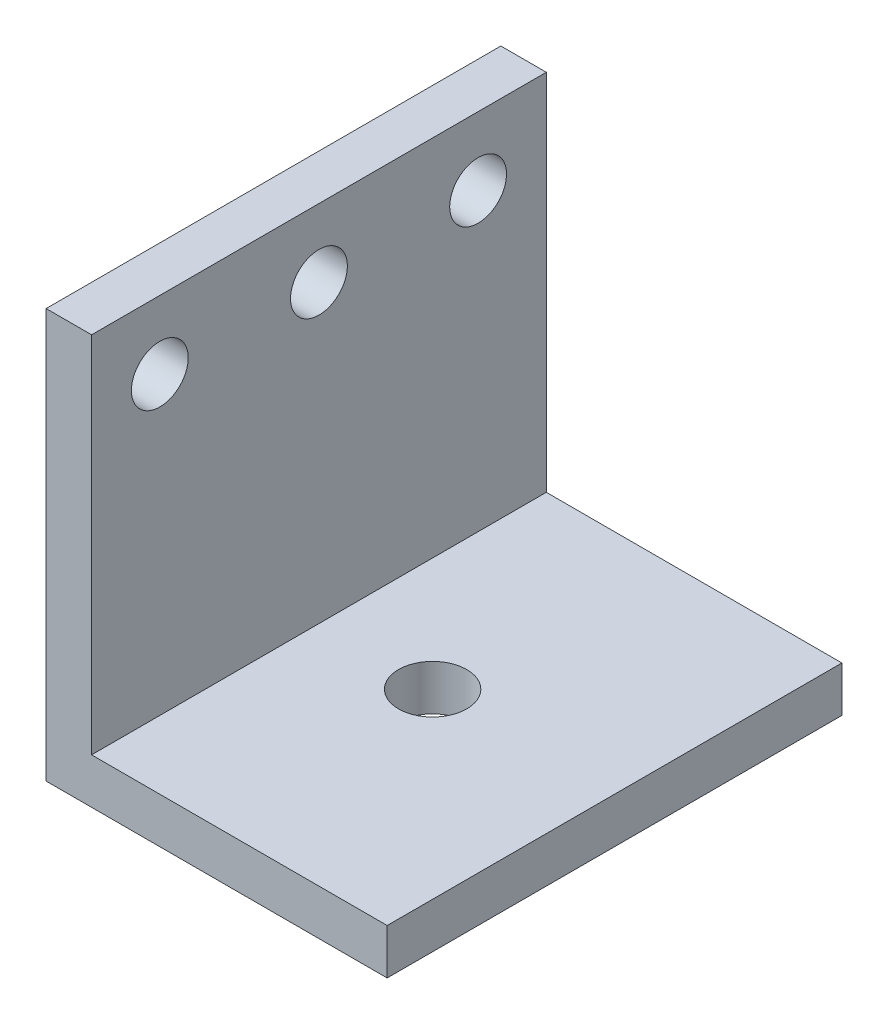
ISO-10303-21;
HEADER;
FILE_DESCRIPTION(('STEP AP214'),'2;1');
FILE_NAME('part.step','',(''),(''),'','','');
FILE_SCHEMA(('AUTOMOTIVE_DESIGN { 1 0 10303 214 1 1 1 1 }'));
ENDSEC;
DATA;
#1=APPLICATION_CONTEXT('core data for automotive mechanical design processes');
#2=APPLICATION_PROTOCOL_DEFINITION('international standard','automotive_design',2000,#1);
#3=PRODUCT_CONTEXT('',#1,'mechanical');
#4=PRODUCT('Part','Part','',(#3));
#5=PRODUCT_RELATED_PRODUCT_CATEGORY('part','',(#4));
#6=PRODUCT_DEFINITION_FORMATION('','',#4);
#7=PRODUCT_DEFINITION_CONTEXT('part definition',#1,'design');
#8=PRODUCT_DEFINITION('design','',#6,#7);
#9=PRODUCT_DEFINITION_SHAPE('','',#8);
#10=(LENGTH_UNIT() NAMED_UNIT(*) SI_UNIT(.MILLI.,.METRE.));
#11=(NAMED_UNIT(*) PLANE_ANGLE_UNIT() SI_UNIT($,.RADIAN.));
#12=(NAMED_UNIT(*) SI_UNIT($,.STERADIAN.) SOLID_ANGLE_UNIT());
#13=UNCERTAINTY_MEASURE_WITH_UNIT(LENGTH_MEASURE(1.E-05),#10,'distance_accuracy_value','');
#14=(GEOMETRIC_REPRESENTATION_CONTEXT(3) GLOBAL_UNCERTAINTY_ASSIGNED_CONTEXT((#13)) GLOBAL_UNIT_ASSIGNED_CONTEXT((#10,
#11,#12)) REPRESENTATION_CONTEXT('',''));
#15=CARTESIAN_POINT('',(0.,0.,0.));
#16=DIRECTION('',(0.,0.,1.));
#17=DIRECTION('',(1.,0.,0.));
#18=AXIS2_PLACEMENT_3D('',#15,#16,#17);
#19=CARTESIAN_POINT('',(0.,0.,100.));
#20=DIRECTION('',(0.,1.,0.));
#21=DIRECTION('',(0.,0.,1.));
#22=AXIS2_PLACEMENT_3D('',#19,#20,#21);
#23=PLANE('',#22);
#24=CARTESIAN_POINT('',(35.,0.,50.));
#25=DIRECTION('',(0.,1.,0.));
#26=DIRECTION('',(0.,0.,1.));
#27=AXIS2_PLACEMENT_3D('',#24,#25,#26);
#28=CIRCLE('',#27,7.5);
#29=CARTESIAN_POINT('',(35.,0.,57.5));
#30=VERTEX_POINT('',#29);
#31=EDGE_CURVE('E161',#30,#30,#28,.T.);
#32=ORIENTED_EDGE('',*,*,#31,.T.);
#33=EDGE_LOOP('',(#32));
#34=FACE_BOUND('',#33,.T.);
#35=DIRECTION('',(1.,0.,0.));
#36=VECTOR('',#35,1.);
#37=CARTESIAN_POINT('',(0.,0.,0.));
#38=LINE('',#37,#36);
#39=CARTESIAN_POINT('',(0.,0.,0.));
#40=VERTEX_POINT('',#39);
#41=CARTESIAN_POINT('',(75.,0.,0.));
#42=VERTEX_POINT('',#41);
#43=EDGE_CURVE('E114',#40,#42,#38,.T.);
#44=ORIENTED_EDGE('',*,*,#43,.T.);
#45=DIRECTION('',(0.,0.,-1.));
#46=VECTOR('',#45,1.);
#47=CARTESIAN_POINT('',(75.,0.,100.));
#48=LINE('',#47,#46);
#49=CARTESIAN_POINT('',(75.,0.,100.));
#50=VERTEX_POINT('',#49);
#51=EDGE_CURVE('E11',#50,#42,#48,.T.);
#52=ORIENTED_EDGE('',*,*,#51,.F.);
#53=DIRECTION('',(1.,0.,0.));
#54=VECTOR('',#53,1.);
#55=CARTESIAN_POINT('',(0.,0.,100.));
#56=LINE('',#55,#54);
#57=CARTESIAN_POINT('',(0.,0.,100.));
#58=VERTEX_POINT('',#57);
#59=EDGE_CURVE('E79',#58,#50,#56,.T.);
#60=ORIENTED_EDGE('',*,*,#59,.F.);
#61=DIRECTION('',(0.,0.,-1.));
#62=VECTOR('',#61,1.);
#63=CARTESIAN_POINT('',(0.,0.,100.));
#64=LINE('',#63,#62);
#65=EDGE_CURVE('E110',#58,#40,#64,.T.);
#66=ORIENTED_EDGE('',*,*,#65,.T.);
#67=EDGE_LOOP('',(#44,#52,#60,#66));
#68=FACE_BOUND('',#67,.T.);
#69=ADVANCED_FACE('F33',(#34,#68),#23,.F.);
#70=CARTESIAN_POINT('',(75.,10.,100.));
#71=DIRECTION('',(1.,0.,0.));
#72=DIRECTION('',(0.,0.,-1.));
#73=AXIS2_PLACEMENT_3D('',#70,#71,#72);
#74=PLANE('',#73);
#75=DIRECTION('',(0.,-1.,0.));
#76=VECTOR('',#75,1.);
#77=CARTESIAN_POINT('',(75.,10.,0.));
#78=LINE('',#77,#76);
#79=CARTESIAN_POINT('',(75.,10.,0.));
#80=VERTEX_POINT('',#79);
#81=EDGE_CURVE('E117',#80,#42,#78,.T.);
#82=ORIENTED_EDGE('',*,*,#81,.F.);
#83=DIRECTION('',(0.,0.,-1.));
#84=VECTOR('',#83,1.);
#85=CARTESIAN_POINT('',(75.,10.,100.));
#86=LINE('',#85,#84);
#87=CARTESIAN_POINT('',(75.,10.,100.));
#88=VERTEX_POINT('',#87);
#89=EDGE_CURVE('E41',#88,#80,#86,.T.);
#90=ORIENTED_EDGE('',*,*,#89,.F.);
#91=DIRECTION('',(0.,-1.,0.));
#92=VECTOR('',#91,1.);
#93=CARTESIAN_POINT('',(75.,10.,100.));
#94=LINE('',#93,#92);
#95=EDGE_CURVE('E186',#88,#50,#94,.T.);
#96=ORIENTED_EDGE('',*,*,#95,.T.);
#97=ORIENTED_EDGE('',*,*,#51,.T.);
#98=EDGE_LOOP('',(#82,#90,#96,#97));
#99=FACE_BOUND('',#98,.T.);
#100=ADVANCED_FACE('F136',(#99),#74,.T.);
#101=CARTESIAN_POINT('',(0.,10.,100.));
#102=DIRECTION('',(0.,1.,0.));
#103=DIRECTION('',(0.,0.,1.));
#104=AXIS2_PLACEMENT_3D('',#101,#102,#103);
#105=PLANE('',#104);
#106=CARTESIAN_POINT('',(35.,10.,50.));
#107=DIRECTION('',(0.,1.,0.));
#108=DIRECTION('',(0.,0.,1.));
#109=AXIS2_PLACEMENT_3D('',#106,#107,#108);
#110=CIRCLE('',#109,7.5);
#111=CARTESIAN_POINT('',(35.,10.,57.5));
#112=VERTEX_POINT('',#111);
#113=EDGE_CURVE('E164',#112,#112,#110,.T.);
#114=ORIENTED_EDGE('',*,*,#113,.F.);
#115=EDGE_LOOP('',(#114));
#116=FACE_BOUND('',#115,.T.);
#117=DIRECTION('',(1.,0.,0.));
#118=VECTOR('',#117,1.);
#119=CARTESIAN_POINT('',(0.,10.,0.));
#120=LINE('',#119,#118);
#121=CARTESIAN_POINT('',(10.,10.,0.));
#122=VERTEX_POINT('',#121);
#123=EDGE_CURVE('E121',#122,#80,#120,.T.);
#124=ORIENTED_EDGE('',*,*,#123,.F.);
#125=DIRECTION('',(0.,0.,-1.));
#126=VECTOR('',#125,1.);
#127=CARTESIAN_POINT('',(10.,10.,100.));
#128=LINE('',#127,#126);
#129=CARTESIAN_POINT('',(10.,10.,100.));
#130=VERTEX_POINT('',#129);
#131=EDGE_CURVE('E100',#130,#122,#128,.T.);
#132=ORIENTED_EDGE('',*,*,#131,.F.);
#133=DIRECTION('',(1.,0.,0.));
#134=VECTOR('',#133,1.);
#135=CARTESIAN_POINT('',(0.,10.,100.));
#136=LINE('',#135,#134);
#137=EDGE_CURVE('E106',#130,#88,#136,.T.);
#138=ORIENTED_EDGE('',*,*,#137,.T.);
#139=ORIENTED_EDGE('',*,*,#89,.T.);
#140=EDGE_LOOP('',(#124,#132,#138,#139));
#141=FACE_BOUND('',#140,.T.);
#142=ADVANCED_FACE('F133',(#116,#141),#105,.T.);
#143=CARTESIAN_POINT('',(10.,90.,100.));
#144=DIRECTION('',(1.,0.,0.));
#145=DIRECTION('',(0.,1.,0.));
#146=AXIS2_PLACEMENT_3D('',#143,#144,#145);
#147=PLANE('',#146);
#148=CARTESIAN_POINT('',(10.,75.,50.));
#149=DIRECTION('',(-1.,0.,0.));
#150=DIRECTION('',(0.,0.,1.));
#151=AXIS2_PLACEMENT_3D('',#148,#149,#150);
#152=CIRCLE('',#151,6.25000000000001);
#153=CARTESIAN_POINT('',(10.,75.,56.25));
#154=VERTEX_POINT('',#153);
#155=EDGE_CURVE('E172',#154,#154,#152,.T.);
#156=ORIENTED_EDGE('',*,*,#155,.T.);
#157=EDGE_LOOP('',(#156));
#158=FACE_BOUND('',#157,.T.);
#159=CARTESIAN_POINT('',(10.,75.,85.));
#160=DIRECTION('',(-1.,0.,0.));
#161=DIRECTION('',(0.,0.,1.));
#162=AXIS2_PLACEMENT_3D('',#159,#160,#161);
#163=CIRCLE('',#162,6.25);
#164=CARTESIAN_POINT('',(10.,75.,91.25));
#165=VERTEX_POINT('',#164);
#166=EDGE_CURVE('E167',#165,#165,#163,.T.);
#167=ORIENTED_EDGE('',*,*,#166,.T.);
#168=EDGE_LOOP('',(#167));
#169=FACE_BOUND('',#168,.T.);
#170=CARTESIAN_POINT('',(10.,75.,15.));
#171=DIRECTION('',(-1.,0.,0.));
#172=DIRECTION('',(0.,0.,1.));
#173=AXIS2_PLACEMENT_3D('',#170,#171,#172);
#174=CIRCLE('',#173,6.25);
#175=CARTESIAN_POINT('',(10.,75.,21.25));
#176=VERTEX_POINT('',#175);
#177=EDGE_CURVE('E118',#176,#176,#174,.T.);
#178=ORIENTED_EDGE('',*,*,#177,.T.);
#179=EDGE_LOOP('',(#178));
#180=FACE_BOUND('',#179,.T.);
#181=DIRECTION('',(0.,-1.,0.));
#182=VECTOR('',#181,1.);
#183=CARTESIAN_POINT('',(10.,90.,0.));
#184=LINE('',#183,#182);
#185=CARTESIAN_POINT('',(10.,90.,0.));
#186=VERTEX_POINT('',#185);
#187=EDGE_CURVE('E95',#186,#122,#184,.T.);
#188=ORIENTED_EDGE('',*,*,#187,.F.);
#189=DIRECTION('',(0.,0.,-1.));
#190=VECTOR('',#189,1.);
#191=CARTESIAN_POINT('',(10.,90.,100.));
#192=LINE('',#191,#190);
#193=CARTESIAN_POINT('',(10.,90.,100.));
#194=VERTEX_POINT('',#193);
#195=EDGE_CURVE('E90',#194,#186,#192,.T.);
#196=ORIENTED_EDGE('',*,*,#195,.F.);
#197=DIRECTION('',(0.,-1.,0.));
#198=VECTOR('',#197,1.);
#199=CARTESIAN_POINT('',(10.,90.,100.));
#200=LINE('',#199,#198);
#201=EDGE_CURVE('E93',#194,#130,#200,.T.);
#202=ORIENTED_EDGE('',*,*,#201,.T.);
#203=ORIENTED_EDGE('',*,*,#131,.T.);
#204=EDGE_LOOP('',(#188,#196,#202,#203));
#205=FACE_BOUND('',#204,.T.);
#206=ADVANCED_FACE('F92',(#158,#169,#180,#205),#147,.T.);
#207=CARTESIAN_POINT('',(0.,90.,100.));
#208=DIRECTION('',(0.,1.,0.));
#209=DIRECTION('',(0.,0.,1.));
#210=AXIS2_PLACEMENT_3D('',#207,#208,#209);
#211=PLANE('',#210);
#212=DIRECTION('',(1.,0.,0.));
#213=VECTOR('',#212,1.);
#214=CARTESIAN_POINT('',(0.,90.,0.));
#215=LINE('',#214,#213);
#216=CARTESIAN_POINT('',(0.,90.,0.));
#217=VERTEX_POINT('',#216);
#218=EDGE_CURVE('E125',#217,#186,#215,.T.);
#219=ORIENTED_EDGE('',*,*,#218,.F.);
#220=DIRECTION('',(0.,0.,-1.));
#221=VECTOR('',#220,1.);
#222=CARTESIAN_POINT('',(0.,90.,100.));
#223=LINE('',#222,#221);
#224=CARTESIAN_POINT('',(0.,90.,100.));
#225=VERTEX_POINT('',#224);
#226=EDGE_CURVE('E70',#225,#217,#223,.T.);
#227=ORIENTED_EDGE('',*,*,#226,.F.);
#228=DIRECTION('',(1.,0.,0.));
#229=VECTOR('',#228,1.);
#230=CARTESIAN_POINT('',(0.,90.,100.));
#231=LINE('',#230,#229);
#232=EDGE_CURVE('E104',#225,#194,#231,.T.);
#233=ORIENTED_EDGE('',*,*,#232,.T.);
#234=ORIENTED_EDGE('',*,*,#195,.T.);
#235=EDGE_LOOP('',(#219,#227,#233,#234));
#236=FACE_BOUND('',#235,.T.);
#237=ADVANCED_FACE('F108',(#236),#211,.T.);
#238=CARTESIAN_POINT('',(0.,90.,100.));
#239=DIRECTION('',(1.,0.,0.));
#240=DIRECTION('',(0.,1.,0.));
#241=AXIS2_PLACEMENT_3D('',#238,#239,#240);
#242=PLANE('',#241);
#243=CARTESIAN_POINT('',(0.,75.,50.));
#244=DIRECTION('',(-1.,0.,0.));
#245=DIRECTION('',(0.,0.,1.));
#246=AXIS2_PLACEMENT_3D('',#243,#244,#245);
#247=CIRCLE('',#246,6.25000000000001);
#248=CARTESIAN_POINT('',(0.,75.,56.25));
#249=VERTEX_POINT('',#248);
#250=EDGE_CURVE('E176',#249,#249,#247,.T.);
#251=ORIENTED_EDGE('',*,*,#250,.F.);
#252=EDGE_LOOP('',(#251));
#253=FACE_BOUND('',#252,.T.);
#254=CARTESIAN_POINT('',(0.,75.,85.));
#255=DIRECTION('',(-1.,0.,0.));
#256=DIRECTION('',(0.,0.,1.));
#257=AXIS2_PLACEMENT_3D('',#254,#255,#256);
#258=CIRCLE('',#257,6.25);
#259=CARTESIAN_POINT('',(0.,75.,91.25));
#260=VERTEX_POINT('',#259);
#261=EDGE_CURVE('E163',#260,#260,#258,.T.);
#262=ORIENTED_EDGE('',*,*,#261,.F.);
#263=EDGE_LOOP('',(#262));
#264=FACE_BOUND('',#263,.T.);
#265=CARTESIAN_POINT('',(0.,75.,15.));
#266=DIRECTION('',(-1.,0.,0.));
#267=DIRECTION('',(0.,0.,1.));
#268=AXIS2_PLACEMENT_3D('',#265,#266,#267);
#269=CIRCLE('',#268,6.25);
#270=CARTESIAN_POINT('',(0.,75.,21.25));
#271=VERTEX_POINT('',#270);
#272=EDGE_CURVE('E175',#271,#271,#269,.T.);
#273=ORIENTED_EDGE('',*,*,#272,.F.);
#274=EDGE_LOOP('',(#273));
#275=FACE_BOUND('',#274,.T.);
#276=DIRECTION('',(0.,-1.,0.));
#277=VECTOR('',#276,1.);
#278=CARTESIAN_POINT('',(0.,90.,0.));
#279=LINE('',#278,#277);
#280=EDGE_CURVE('E73',#217,#40,#279,.T.);
#281=ORIENTED_EDGE('',*,*,#280,.T.);
#282=ORIENTED_EDGE('',*,*,#65,.F.);
#283=DIRECTION('',(0.,-1.,0.));
#284=VECTOR('',#283,1.);
#285=CARTESIAN_POINT('',(0.,90.,100.));
#286=LINE('',#285,#284);
#287=EDGE_CURVE('E49',#225,#58,#286,.T.);
#288=ORIENTED_EDGE('',*,*,#287,.F.);
#289=ORIENTED_EDGE('',*,*,#226,.T.);
#290=EDGE_LOOP('',(#281,#282,#288,#289));
#291=FACE_BOUND('',#290,.T.);
#292=ADVANCED_FACE('F141',(#253,#264,#275,#291),#242,.F.);
#293=CARTESIAN_POINT('',(0.,0.,100.));
#294=DIRECTION('',(0.,0.,-1.));
#295=DIRECTION('',(-1.,0.,0.));
#296=AXIS2_PLACEMENT_3D('',#293,#294,#295);
#297=PLANE('',#296);
#298=ORIENTED_EDGE('',*,*,#59,.T.);
#299=ORIENTED_EDGE('',*,*,#95,.F.);
#300=ORIENTED_EDGE('',*,*,#137,.F.);
#301=ORIENTED_EDGE('',*,*,#201,.F.);
#302=ORIENTED_EDGE('',*,*,#232,.F.);
#303=ORIENTED_EDGE('',*,*,#287,.T.);
#304=EDGE_LOOP('',(#298,#299,#300,#301,#302,#303));
#305=FACE_BOUND('',#304,.T.);
#306=ADVANCED_FACE('F103',(#305),#297,.F.);
#307=CARTESIAN_POINT('',(0.,0.,0.));
#308=DIRECTION('',(0.,0.,-1.));
#309=DIRECTION('',(-1.,0.,0.));
#310=AXIS2_PLACEMENT_3D('',#307,#308,#309);
#311=PLANE('',#310);
#312=ORIENTED_EDGE('',*,*,#43,.F.);
#313=ORIENTED_EDGE('',*,*,#280,.F.);
#314=ORIENTED_EDGE('',*,*,#218,.T.);
#315=ORIENTED_EDGE('',*,*,#187,.T.);
#316=ORIENTED_EDGE('',*,*,#123,.T.);
#317=ORIENTED_EDGE('',*,*,#81,.T.);
#318=EDGE_LOOP('',(#312,#313,#314,#315,#316,#317));
#319=FACE_BOUND('',#318,.T.);
#320=ADVANCED_FACE('F139',(#319),#311,.T.);
#321=CARTESIAN_POINT('',(10.,75.,15.));
#322=DIRECTION('',(-1.,0.,0.));
#323=DIRECTION('',(0.,0.,1.));
#324=AXIS2_PLACEMENT_3D('',#321,#322,#323);
#325=CYLINDRICAL_SURFACE('',#324,6.25);
#326=ORIENTED_EDGE('',*,*,#177,.F.);
#327=EDGE_LOOP('',(#326));
#328=FACE_BOUND('',#327,.T.);
#329=ORIENTED_EDGE('',*,*,#272,.T.);
#330=EDGE_LOOP('',(#329));
#331=FACE_BOUND('',#330,.T.);
#332=ADVANCED_FACE('F189',(#328,#331),#325,.F.);
#333=CARTESIAN_POINT('',(10.,75.,85.));
#334=DIRECTION('',(-1.,0.,0.));
#335=DIRECTION('',(0.,0.,1.));
#336=AXIS2_PLACEMENT_3D('',#333,#334,#335);
#337=CYLINDRICAL_SURFACE('',#336,6.25);
#338=ORIENTED_EDGE('',*,*,#166,.F.);
#339=EDGE_LOOP('',(#338));
#340=FACE_BOUND('',#339,.T.);
#341=ORIENTED_EDGE('',*,*,#261,.T.);
#342=EDGE_LOOP('',(#341));
#343=FACE_BOUND('',#342,.T.);
#344=ADVANCED_FACE('F192',(#340,#343),#337,.F.);
#345=CARTESIAN_POINT('',(10.,75.,50.));
#346=DIRECTION('',(-1.,0.,0.));
#347=DIRECTION('',(0.,0.,1.));
#348=AXIS2_PLACEMENT_3D('',#345,#346,#347);
#349=CYLINDRICAL_SURFACE('',#348,6.25000000000001);
#350=ORIENTED_EDGE('',*,*,#155,.F.);
#351=EDGE_LOOP('',(#350));
#352=FACE_BOUND('',#351,.T.);
#353=ORIENTED_EDGE('',*,*,#250,.T.);
#354=EDGE_LOOP('',(#353));
#355=FACE_BOUND('',#354,.T.);
#356=ADVANCED_FACE('F199',(#352,#355),#349,.F.);
#357=CARTESIAN_POINT('',(35.,0.,50.));
#358=DIRECTION('',(0.,1.,0.));
#359=DIRECTION('',(0.,0.,1.));
#360=AXIS2_PLACEMENT_3D('',#357,#358,#359);
#361=CYLINDRICAL_SURFACE('',#360,7.5);
#362=ORIENTED_EDGE('',*,*,#31,.F.);
#363=EDGE_LOOP('',(#362));
#364=FACE_BOUND('',#363,.T.);
#365=ORIENTED_EDGE('',*,*,#113,.T.);
#366=EDGE_LOOP('',(#365));
#367=FACE_BOUND('',#366,.T.);
#368=ADVANCED_FACE('F206',(#364,#367),#361,.F.);
#369=CLOSED_SHELL('',(#69,#100,#142,#206,#237,#292,#306,#320,#332,#344,#356,#368));
#370=MANIFOLD_SOLID_BREP('B2',#369);
#371=ADVANCED_BREP_SHAPE_REPRESENTATION('',(#18,#370),#14);
#372=SHAPE_DEFINITION_REPRESENTATION(#9,#371);
ENDSEC;
END-ISO-10303-21;
